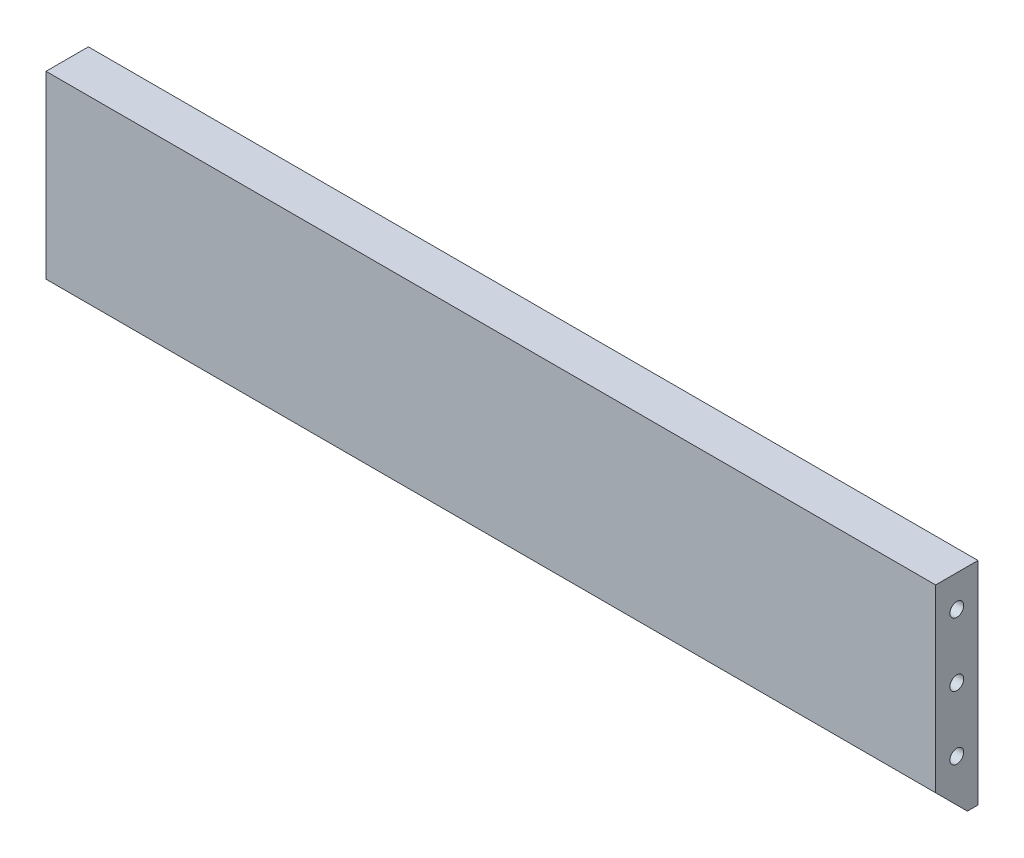
ISO-10303-21;
HEADER;
FILE_DESCRIPTION(('STEP AP214'),'2;1');
FILE_NAME('part.step','',(''),(''),'','','');
FILE_SCHEMA(('AUTOMOTIVE_DESIGN { 1 0 10303 214 1 1 1 1 }'));
ENDSEC;
DATA;
#1=APPLICATION_CONTEXT('core data for automotive mechanical design processes');
#2=APPLICATION_PROTOCOL_DEFINITION('international standard','automotive_design',2000,#1);
#3=PRODUCT_CONTEXT('',#1,'mechanical');
#4=PRODUCT('Part','Part','',(#3));
#5=PRODUCT_RELATED_PRODUCT_CATEGORY('part','',(#4));
#6=PRODUCT_DEFINITION_FORMATION('','',#4);
#7=PRODUCT_DEFINITION_CONTEXT('part definition',#1,'design');
#8=PRODUCT_DEFINITION('design','',#6,#7);
#9=PRODUCT_DEFINITION_SHAPE('','',#8);
#10=(LENGTH_UNIT() NAMED_UNIT(*) SI_UNIT(.MILLI.,.METRE.));
#11=(NAMED_UNIT(*) PLANE_ANGLE_UNIT() SI_UNIT($,.RADIAN.));
#12=(NAMED_UNIT(*) SI_UNIT($,.STERADIAN.) SOLID_ANGLE_UNIT());
#13=UNCERTAINTY_MEASURE_WITH_UNIT(LENGTH_MEASURE(1.E-05),#10,'distance_accuracy_value','');
#14=(GEOMETRIC_REPRESENTATION_CONTEXT(3) GLOBAL_UNCERTAINTY_ASSIGNED_CONTEXT((#13)) GLOBAL_UNIT_ASSIGNED_CONTEXT((#10,
#11,#12)) REPRESENTATION_CONTEXT('',''));
#15=CARTESIAN_POINT('',(0.,0.,0.));
#16=DIRECTION('',(0.,0.,1.));
#17=DIRECTION('',(1.,0.,0.));
#18=AXIS2_PLACEMENT_3D('',#15,#16,#17);
#19=CARTESIAN_POINT('',(210.,50.,20.));
#20=DIRECTION('',(-1.,0.,0.));
#21=DIRECTION('',(0.,0.,1.));
#22=AXIS2_PLACEMENT_3D('',#19,#20,#21);
#23=PLANE('',#22);
#24=CARTESIAN_POINT('',(210.,35.,10.));
#25=DIRECTION('',(1.,0.,0.));
#26=DIRECTION('',(0.,0.,-1.));
#27=AXIS2_PLACEMENT_3D('',#24,#25,#26);
#28=CIRCLE('',#27,3.25);
#29=CARTESIAN_POINT('',(210.,35.,6.75));
#30=VERTEX_POINT('',#29);
#31=EDGE_CURVE('E140',#30,#30,#28,.T.);
#32=ORIENTED_EDGE('',*,*,#31,.F.);
#33=EDGE_LOOP('',(#32));
#34=FACE_BOUND('',#33,.T.);
#35=CARTESIAN_POINT('',(210.,4.99999999999999,10.));
#36=DIRECTION('',(1.,0.,0.));
#37=DIRECTION('',(0.,0.,-1.));
#38=AXIS2_PLACEMENT_3D('',#35,#36,#37);
#39=CIRCLE('',#38,3.25);
#40=CARTESIAN_POINT('',(210.,4.99999999999999,6.75));
#41=VERTEX_POINT('',#40);
#42=EDGE_CURVE('E134',#41,#41,#39,.T.);
#43=ORIENTED_EDGE('',*,*,#42,.F.);
#44=EDGE_LOOP('',(#43));
#45=FACE_BOUND('',#44,.T.);
#46=CARTESIAN_POINT('',(210.,-25.,10.));
#47=DIRECTION('',(1.,0.,0.));
#48=DIRECTION('',(0.,0.,-1.));
#49=AXIS2_PLACEMENT_3D('',#46,#47,#48);
#50=CIRCLE('',#49,3.25);
#51=CARTESIAN_POINT('',(210.,-25.,6.75));
#52=VERTEX_POINT('',#51);
#53=EDGE_CURVE('E127',#52,#52,#50,.T.);
#54=ORIENTED_EDGE('',*,*,#53,.F.);
#55=EDGE_LOOP('',(#54));
#56=FACE_BOUND('',#55,.T.);
#57=DIRECTION('',(0.,1.,0.));
#58=VECTOR('',#57,1.);
#59=CARTESIAN_POINT('',(210.,50.,20.));
#60=LINE('',#59,#58);
#61=CARTESIAN_POINT('',(210.,-34.9999999999999,20.));
#62=VERTEX_POINT('',#61);
#63=CARTESIAN_POINT('',(210.,50.,20.));
#64=VERTEX_POINT('',#63);
#65=EDGE_CURVE('E85',#62,#64,#60,.T.);
#66=ORIENTED_EDGE('',*,*,#65,.F.);
#67=DIRECTION('',(0.,-0.707106781186546,-0.707106781186549));
#68=VECTOR('',#67,1.);
#69=CARTESIAN_POINT('',(210.,-34.9999999999999,20.));
#70=LINE('',#69,#68);
#71=CARTESIAN_POINT('',(210.,-50.,4.99999999999982));
#72=VERTEX_POINT('',#71);
#73=EDGE_CURVE('E63',#62,#72,#70,.T.);
#74=ORIENTED_EDGE('',*,*,#73,.T.);
#75=DIRECTION('',(0.,0.,-1.));
#76=VECTOR('',#75,1.);
#77=CARTESIAN_POINT('',(210.,-50.,20.));
#78=LINE('',#77,#76);
#79=CARTESIAN_POINT('',(210.,-50.,0.));
#80=VERTEX_POINT('',#79);
#81=EDGE_CURVE('E115',#72,#80,#78,.T.);
#82=ORIENTED_EDGE('',*,*,#81,.T.);
#83=DIRECTION('',(0.,1.,0.));
#84=VECTOR('',#83,1.);
#85=CARTESIAN_POINT('',(210.,50.,0.));
#86=LINE('',#85,#84);
#87=CARTESIAN_POINT('',(210.,50.,0.));
#88=VERTEX_POINT('',#87);
#89=EDGE_CURVE('E107',#80,#88,#86,.T.);
#90=ORIENTED_EDGE('',*,*,#89,.T.);
#91=DIRECTION('',(0.,0.,-1.));
#92=VECTOR('',#91,1.);
#93=CARTESIAN_POINT('',(210.,50.,20.));
#94=LINE('',#93,#92);
#95=EDGE_CURVE('E99',#64,#88,#94,.T.);
#96=ORIENTED_EDGE('',*,*,#95,.F.);
#97=EDGE_LOOP('',(#66,#74,#82,#90,#96));
#98=FACE_BOUND('',#97,.T.);
#99=ADVANCED_FACE('F40',(#34,#45,#56,#98),#23,.F.);
#100=CARTESIAN_POINT('',(-210.,50.,20.));
#101=DIRECTION('',(0.,-1.,0.));
#102=DIRECTION('',(0.,0.,-1.));
#103=AXIS2_PLACEMENT_3D('',#100,#101,#102);
#104=PLANE('',#103);
#105=DIRECTION('',(-1.,0.,0.));
#106=VECTOR('',#105,1.);
#107=CARTESIAN_POINT('',(-210.,50.,0.));
#108=LINE('',#107,#106);
#109=CARTESIAN_POINT('',(-210.,50.,0.));
#110=VERTEX_POINT('',#109);
#111=EDGE_CURVE('E122',#88,#110,#108,.T.);
#112=ORIENTED_EDGE('',*,*,#111,.T.);
#113=DIRECTION('',(0.,0.,-1.));
#114=VECTOR('',#113,1.);
#115=CARTESIAN_POINT('',(-210.,50.,20.));
#116=LINE('',#115,#114);
#117=CARTESIAN_POINT('',(-210.,50.,20.));
#118=VERTEX_POINT('',#117);
#119=EDGE_CURVE('E102',#118,#110,#116,.T.);
#120=ORIENTED_EDGE('',*,*,#119,.F.);
#121=DIRECTION('',(-1.,0.,0.));
#122=VECTOR('',#121,1.);
#123=CARTESIAN_POINT('',(-210.,50.,20.));
#124=LINE('',#123,#122);
#125=EDGE_CURVE('E89',#64,#118,#124,.T.);
#126=ORIENTED_EDGE('',*,*,#125,.F.);
#127=ORIENTED_EDGE('',*,*,#95,.T.);
#128=EDGE_LOOP('',(#112,#120,#126,#127));
#129=FACE_BOUND('',#128,.T.);
#130=ADVANCED_FACE('F98',(#129),#104,.F.);
#131=CARTESIAN_POINT('',(-210.,50.,20.));
#132=DIRECTION('',(1.,0.,0.));
#133=DIRECTION('',(0.,1.,0.));
#134=AXIS2_PLACEMENT_3D('',#131,#132,#133);
#135=PLANE('',#134);
#136=CARTESIAN_POINT('',(-210.,35.,10.));
#137=DIRECTION('',(1.,0.,0.));
#138=DIRECTION('',(0.,0.,-1.));
#139=AXIS2_PLACEMENT_3D('',#136,#137,#138);
#140=CIRCLE('',#139,3.25);
#141=CARTESIAN_POINT('',(-210.,35.,6.75));
#142=VERTEX_POINT('',#141);
#143=EDGE_CURVE('E157',#142,#142,#140,.T.);
#144=ORIENTED_EDGE('',*,*,#143,.T.);
#145=EDGE_LOOP('',(#144));
#146=FACE_BOUND('',#145,.T.);
#147=CARTESIAN_POINT('',(-210.,4.99999999999999,10.));
#148=DIRECTION('',(1.,0.,0.));
#149=DIRECTION('',(0.,0.,-1.));
#150=AXIS2_PLACEMENT_3D('',#147,#148,#149);
#151=CIRCLE('',#150,3.25);
#152=CARTESIAN_POINT('',(-210.,4.99999999999999,6.75));
#153=VERTEX_POINT('',#152);
#154=EDGE_CURVE('E151',#153,#153,#151,.T.);
#155=ORIENTED_EDGE('',*,*,#154,.T.);
#156=EDGE_LOOP('',(#155));
#157=FACE_BOUND('',#156,.T.);
#158=CARTESIAN_POINT('',(-210.,-25.,10.));
#159=DIRECTION('',(1.,0.,0.));
#160=DIRECTION('',(0.,0.,-1.));
#161=AXIS2_PLACEMENT_3D('',#158,#159,#160);
#162=CIRCLE('',#161,3.25);
#163=CARTESIAN_POINT('',(-210.,-25.,6.75));
#164=VERTEX_POINT('',#163);
#165=EDGE_CURVE('E145',#164,#164,#162,.T.);
#166=ORIENTED_EDGE('',*,*,#165,.T.);
#167=EDGE_LOOP('',(#166));
#168=FACE_BOUND('',#167,.T.);
#169=DIRECTION('',(0.,0.,-1.));
#170=VECTOR('',#169,1.);
#171=CARTESIAN_POINT('',(-210.,-50.,20.));
#172=LINE('',#171,#170);
#173=CARTESIAN_POINT('',(-210.,-50.,4.99999999999982));
#174=VERTEX_POINT('',#173);
#175=CARTESIAN_POINT('',(-210.,-50.,0.));
#176=VERTEX_POINT('',#175);
#177=EDGE_CURVE('E110',#174,#176,#172,.T.);
#178=ORIENTED_EDGE('',*,*,#177,.F.);
#179=DIRECTION('',(0.,0.707106781186546,0.707106781186549));
#180=VECTOR('',#179,1.);
#181=CARTESIAN_POINT('',(-210.,-34.9999999999999,20.));
#182=LINE('',#181,#180);
#183=CARTESIAN_POINT('',(-210.,-34.9999999999999,20.));
#184=VERTEX_POINT('',#183);
#185=EDGE_CURVE('E11',#174,#184,#182,.T.);
#186=ORIENTED_EDGE('',*,*,#185,.T.);
#187=DIRECTION('',(0.,-1.,0.));
#188=VECTOR('',#187,1.);
#189=CARTESIAN_POINT('',(-210.,50.,20.));
#190=LINE('',#189,#188);
#191=EDGE_CURVE('E104',#118,#184,#190,.T.);
#192=ORIENTED_EDGE('',*,*,#191,.F.);
#193=ORIENTED_EDGE('',*,*,#119,.T.);
#194=DIRECTION('',(0.,-1.,0.));
#195=VECTOR('',#194,1.);
#196=CARTESIAN_POINT('',(-210.,50.,0.));
#197=LINE('',#196,#195);
#198=EDGE_CURVE('E119',#110,#176,#197,.T.);
#199=ORIENTED_EDGE('',*,*,#198,.T.);
#200=EDGE_LOOP('',(#178,#186,#192,#193,#199));
#201=FACE_BOUND('',#200,.T.);
#202=ADVANCED_FACE('F179',(#146,#157,#168,#201),#135,.F.);
#203=CARTESIAN_POINT('',(-210.,-50.,20.));
#204=DIRECTION('',(0.,1.,0.));
#205=DIRECTION('',(0.,0.,1.));
#206=AXIS2_PLACEMENT_3D('',#203,#204,#205);
#207=PLANE('',#206);
#208=ORIENTED_EDGE('',*,*,#81,.F.);
#209=DIRECTION('',(-1.,0.,0.));
#210=VECTOR('',#209,1.);
#211=CARTESIAN_POINT('',(-210.,-50.,4.99999999999982));
#212=LINE('',#211,#210);
#213=EDGE_CURVE('E49',#72,#174,#212,.T.);
#214=ORIENTED_EDGE('',*,*,#213,.T.);
#215=ORIENTED_EDGE('',*,*,#177,.T.);
#216=DIRECTION('',(1.,0.,0.));
#217=VECTOR('',#216,1.);
#218=CARTESIAN_POINT('',(-210.,-50.,0.));
#219=LINE('',#218,#217);
#220=EDGE_CURVE('E94',#176,#80,#219,.T.);
#221=ORIENTED_EDGE('',*,*,#220,.T.);
#222=EDGE_LOOP('',(#208,#214,#215,#221));
#223=FACE_BOUND('',#222,.T.);
#224=ADVANCED_FACE('F186',(#223),#207,.F.);
#225=CARTESIAN_POINT('',(0.,0.,20.));
#226=DIRECTION('',(0.,0.,1.));
#227=DIRECTION('',(1.,0.,0.));
#228=AXIS2_PLACEMENT_3D('',#225,#226,#227);
#229=PLANE('',#228);
#230=ORIENTED_EDGE('',*,*,#191,.T.);
#231=DIRECTION('',(1.,0.,0.));
#232=VECTOR('',#231,1.);
#233=CARTESIAN_POINT('',(210.,-34.9999999999999,20.));
#234=LINE('',#233,#232);
#235=EDGE_CURVE('E92',#184,#62,#234,.T.);
#236=ORIENTED_EDGE('',*,*,#235,.T.);
#237=ORIENTED_EDGE('',*,*,#65,.T.);
#238=ORIENTED_EDGE('',*,*,#125,.T.);
#239=EDGE_LOOP('',(#230,#236,#237,#238));
#240=FACE_BOUND('',#239,.T.);
#241=ADVANCED_FACE('F88',(#240),#229,.T.);
#242=CARTESIAN_POINT('',(0.,0.,0.));
#243=DIRECTION('',(0.,0.,1.));
#244=DIRECTION('',(1.,0.,0.));
#245=AXIS2_PLACEMENT_3D('',#242,#243,#244);
#246=PLANE('',#245);
#247=ORIENTED_EDGE('',*,*,#89,.F.);
#248=ORIENTED_EDGE('',*,*,#220,.F.);
#249=ORIENTED_EDGE('',*,*,#198,.F.);
#250=ORIENTED_EDGE('',*,*,#111,.F.);
#251=EDGE_LOOP('',(#247,#248,#249,#250));
#252=FACE_BOUND('',#251,.T.);
#253=ADVANCED_FACE('F190',(#252),#246,.F.);
#254=CARTESIAN_POINT('',(0.,-34.9999999999999,20.));
#255=DIRECTION('',(0.,-0.707106781186549,0.707106781186546));
#256=DIRECTION('',(-1.,0.,0.));
#257=AXIS2_PLACEMENT_3D('',#254,#255,#256);
#258=PLANE('',#257);
#259=ORIENTED_EDGE('',*,*,#185,.F.);
#260=ORIENTED_EDGE('',*,*,#213,.F.);
#261=ORIENTED_EDGE('',*,*,#73,.F.);
#262=ORIENTED_EDGE('',*,*,#235,.F.);
#263=EDGE_LOOP('',(#259,#260,#261,#262));
#264=FACE_BOUND('',#263,.T.);
#265=ADVANCED_FACE('F43',(#264),#258,.T.);
#266=CARTESIAN_POINT('',(180.,-25.,10.));
#267=DIRECTION('',(1.,0.,0.));
#268=DIRECTION('',(0.,0.,-1.));
#269=AXIS2_PLACEMENT_3D('',#266,#267,#268);
#270=CYLINDRICAL_SURFACE('',#269,3.25);
#271=CARTESIAN_POINT('',(180.,-25.,10.));
#272=DIRECTION('',(1.,0.,0.));
#273=DIRECTION('',(0.,0.,-1.));
#274=AXIS2_PLACEMENT_3D('',#271,#272,#273);
#275=CIRCLE('',#274,3.25);
#276=CARTESIAN_POINT('',(180.,-25.,6.75));
#277=VERTEX_POINT('',#276);
#278=EDGE_CURVE('E130',#277,#277,#275,.T.);
#279=ORIENTED_EDGE('',*,*,#278,.F.);
#280=EDGE_LOOP('',(#279));
#281=FACE_BOUND('',#280,.T.);
#282=ORIENTED_EDGE('',*,*,#53,.T.);
#283=EDGE_LOOP('',(#282));
#284=FACE_BOUND('',#283,.T.);
#285=ADVANCED_FACE('F196',(#281,#284),#270,.F.);
#286=CARTESIAN_POINT('',(180.,-25.,10.));
#287=DIRECTION('',(1.,0.,0.));
#288=DIRECTION('',(0.,0.,-1.));
#289=AXIS2_PLACEMENT_3D('',#286,#287,#288);
#290=PLANE('',#289);
#291=ORIENTED_EDGE('',*,*,#278,.T.);
#292=EDGE_LOOP('',(#291));
#293=FACE_BOUND('',#292,.T.);
#294=ADVANCED_FACE('F199',(#293),#290,.T.);
#295=CARTESIAN_POINT('',(180.,4.99999999999999,10.));
#296=DIRECTION('',(1.,0.,0.));
#297=DIRECTION('',(0.,0.,-1.));
#298=AXIS2_PLACEMENT_3D('',#295,#296,#297);
#299=CYLINDRICAL_SURFACE('',#298,3.25);
#300=CARTESIAN_POINT('',(180.,4.99999999999999,10.));
#301=DIRECTION('',(1.,0.,0.));
#302=DIRECTION('',(0.,0.,-1.));
#303=AXIS2_PLACEMENT_3D('',#300,#301,#302);
#304=CIRCLE('',#303,3.25);
#305=CARTESIAN_POINT('',(180.,4.99999999999999,6.75));
#306=VERTEX_POINT('',#305);
#307=EDGE_CURVE('E137',#306,#306,#304,.T.);
#308=ORIENTED_EDGE('',*,*,#307,.F.);
#309=EDGE_LOOP('',(#308));
#310=FACE_BOUND('',#309,.T.);
#311=ORIENTED_EDGE('',*,*,#42,.T.);
#312=EDGE_LOOP('',(#311));
#313=FACE_BOUND('',#312,.T.);
#314=ADVANCED_FACE('F203',(#310,#313),#299,.F.);
#315=CARTESIAN_POINT('',(180.,4.99999999999999,10.));
#316=DIRECTION('',(1.,0.,0.));
#317=DIRECTION('',(0.,0.,-1.));
#318=AXIS2_PLACEMENT_3D('',#315,#316,#317);
#319=PLANE('',#318);
#320=ORIENTED_EDGE('',*,*,#307,.T.);
#321=EDGE_LOOP('',(#320));
#322=FACE_BOUND('',#321,.T.);
#323=ADVANCED_FACE('F207',(#322),#319,.T.);
#324=CARTESIAN_POINT('',(180.,35.,10.));
#325=DIRECTION('',(1.,0.,0.));
#326=DIRECTION('',(0.,0.,-1.));
#327=AXIS2_PLACEMENT_3D('',#324,#325,#326);
#328=CYLINDRICAL_SURFACE('',#327,3.25);
#329=CARTESIAN_POINT('',(180.,35.,10.));
#330=DIRECTION('',(1.,0.,0.));
#331=DIRECTION('',(0.,0.,-1.));
#332=AXIS2_PLACEMENT_3D('',#329,#330,#331);
#333=CIRCLE('',#332,3.25);
#334=CARTESIAN_POINT('',(180.,35.,6.75));
#335=VERTEX_POINT('',#334);
#336=EDGE_CURVE('E125',#335,#335,#333,.T.);
#337=ORIENTED_EDGE('',*,*,#336,.F.);
#338=EDGE_LOOP('',(#337));
#339=FACE_BOUND('',#338,.T.);
#340=ORIENTED_EDGE('',*,*,#31,.T.);
#341=EDGE_LOOP('',(#340));
#342=FACE_BOUND('',#341,.T.);
#343=ADVANCED_FACE('F211',(#339,#342),#328,.F.);
#344=CARTESIAN_POINT('',(180.,35.,10.));
#345=DIRECTION('',(1.,0.,0.));
#346=DIRECTION('',(0.,0.,-1.));
#347=AXIS2_PLACEMENT_3D('',#344,#345,#346);
#348=PLANE('',#347);
#349=ORIENTED_EDGE('',*,*,#336,.T.);
#350=EDGE_LOOP('',(#349));
#351=FACE_BOUND('',#350,.T.);
#352=ADVANCED_FACE('F215',(#351),#348,.T.);
#353=CARTESIAN_POINT('',(-180.,-25.,10.));
#354=DIRECTION('',(-1.,0.,0.));
#355=DIRECTION('',(0.,0.,1.));
#356=AXIS2_PLACEMENT_3D('',#353,#354,#355);
#357=CYLINDRICAL_SURFACE('',#356,3.25);
#358=CARTESIAN_POINT('',(-180.,-25.,10.));
#359=DIRECTION('',(1.,0.,0.));
#360=DIRECTION('',(0.,0.,-1.));
#361=AXIS2_PLACEMENT_3D('',#358,#359,#360);
#362=CIRCLE('',#361,3.25);
#363=CARTESIAN_POINT('',(-180.,-25.,6.75));
#364=VERTEX_POINT('',#363);
#365=EDGE_CURVE('E148',#364,#364,#362,.T.);
#366=ORIENTED_EDGE('',*,*,#365,.T.);
#367=EDGE_LOOP('',(#366));
#368=FACE_BOUND('',#367,.T.);
#369=ORIENTED_EDGE('',*,*,#165,.F.);
#370=EDGE_LOOP('',(#369));
#371=FACE_BOUND('',#370,.T.);
#372=ADVANCED_FACE('F219',(#368,#371),#357,.F.);
#373=CARTESIAN_POINT('',(-180.,-25.,10.));
#374=DIRECTION('',(-1.,0.,0.));
#375=DIRECTION('',(0.,0.,-1.));
#376=AXIS2_PLACEMENT_3D('',#373,#374,#375);
#377=PLANE('',#376);
#378=ORIENTED_EDGE('',*,*,#365,.F.);
#379=EDGE_LOOP('',(#378));
#380=FACE_BOUND('',#379,.T.);
#381=ADVANCED_FACE('F223',(#380),#377,.T.);
#382=CARTESIAN_POINT('',(-180.,4.99999999999999,10.));
#383=DIRECTION('',(-1.,0.,0.));
#384=DIRECTION('',(0.,0.,1.));
#385=AXIS2_PLACEMENT_3D('',#382,#383,#384);
#386=CYLINDRICAL_SURFACE('',#385,3.25);
#387=CARTESIAN_POINT('',(-180.,4.99999999999999,10.));
#388=DIRECTION('',(1.,0.,0.));
#389=DIRECTION('',(0.,0.,-1.));
#390=AXIS2_PLACEMENT_3D('',#387,#388,#389);
#391=CIRCLE('',#390,3.25);
#392=CARTESIAN_POINT('',(-180.,4.99999999999999,6.75));
#393=VERTEX_POINT('',#392);
#394=EDGE_CURVE('E154',#393,#393,#391,.T.);
#395=ORIENTED_EDGE('',*,*,#394,.T.);
#396=EDGE_LOOP('',(#395));
#397=FACE_BOUND('',#396,.T.);
#398=ORIENTED_EDGE('',*,*,#154,.F.);
#399=EDGE_LOOP('',(#398));
#400=FACE_BOUND('',#399,.T.);
#401=ADVANCED_FACE('F227',(#397,#400),#386,.F.);
#402=CARTESIAN_POINT('',(-180.,4.99999999999999,10.));
#403=DIRECTION('',(-1.,0.,0.));
#404=DIRECTION('',(0.,0.,-1.));
#405=AXIS2_PLACEMENT_3D('',#402,#403,#404);
#406=PLANE('',#405);
#407=ORIENTED_EDGE('',*,*,#394,.F.);
#408=EDGE_LOOP('',(#407));
#409=FACE_BOUND('',#408,.T.);
#410=ADVANCED_FACE('F172',(#409),#406,.T.);
#411=CARTESIAN_POINT('',(-180.,35.,10.));
#412=DIRECTION('',(-1.,0.,0.));
#413=DIRECTION('',(0.,0.,1.));
#414=AXIS2_PLACEMENT_3D('',#411,#412,#413);
#415=CYLINDRICAL_SURFACE('',#414,3.25);
#416=CARTESIAN_POINT('',(-180.,35.,10.));
#417=DIRECTION('',(1.,0.,0.));
#418=DIRECTION('',(0.,0.,-1.));
#419=AXIS2_PLACEMENT_3D('',#416,#417,#418);
#420=CIRCLE('',#419,3.25);
#421=CARTESIAN_POINT('',(-180.,35.,6.75));
#422=VERTEX_POINT('',#421);
#423=EDGE_CURVE('E131',#422,#422,#420,.T.);
#424=ORIENTED_EDGE('',*,*,#423,.T.);
#425=EDGE_LOOP('',(#424));
#426=FACE_BOUND('',#425,.T.);
#427=ORIENTED_EDGE('',*,*,#143,.F.);
#428=EDGE_LOOP('',(#427));
#429=FACE_BOUND('',#428,.T.);
#430=ADVANCED_FACE('F163',(#426,#429),#415,.F.);
#431=CARTESIAN_POINT('',(-180.,35.,10.));
#432=DIRECTION('',(-1.,0.,0.));
#433=DIRECTION('',(0.,0.,-1.));
#434=AXIS2_PLACEMENT_3D('',#431,#432,#433);
#435=PLANE('',#434);
#436=ORIENTED_EDGE('',*,*,#423,.F.);
#437=EDGE_LOOP('',(#436));
#438=FACE_BOUND('',#437,.T.);
#439=ADVANCED_FACE('F166',(#438),#435,.T.);
#440=CLOSED_SHELL('',(#99,#130,#202,#224,#241,#253,#265,#285,#294,#314,#323,#343,#352,#372,#381,
#401,#410,#430,#439));
#441=MANIFOLD_SOLID_BREP('B2',#440);
#442=ADVANCED_BREP_SHAPE_REPRESENTATION('',(#18,#441),#14);
#443=SHAPE_DEFINITION_REPRESENTATION(#9,#442);
ENDSEC;
END-ISO-10303-21;
